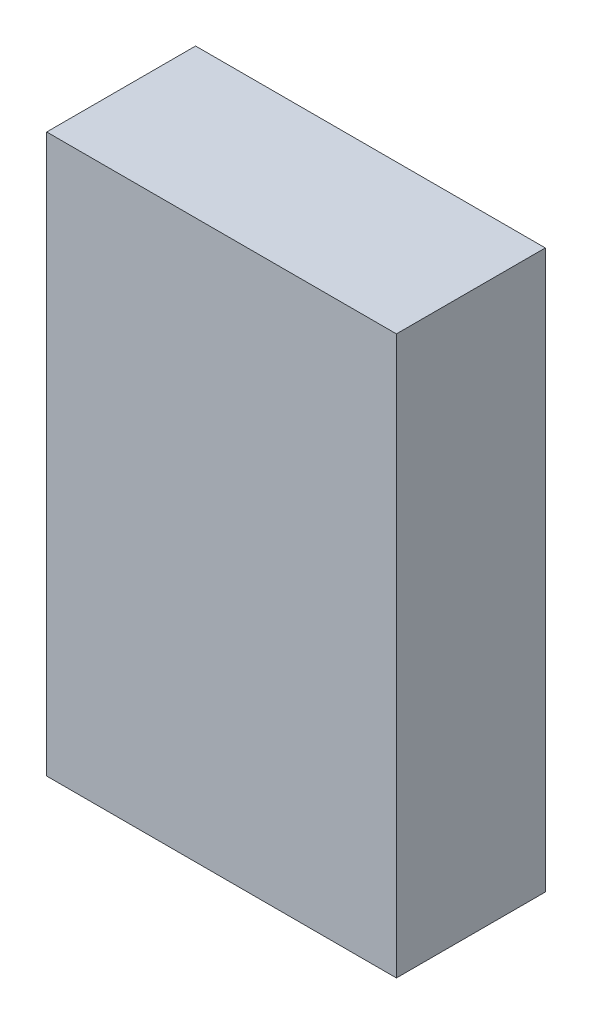
ISO-10303-21;
HEADER;
FILE_DESCRIPTION(('STEP AP214'),'2;1');
FILE_NAME('part.step','',(''),(''),'','','');
FILE_SCHEMA(('AUTOMOTIVE_DESIGN { 1 0 10303 214 1 1 1 1 }'));
ENDSEC;
DATA;
#1=APPLICATION_CONTEXT('core data for automotive mechanical design processes');
#2=APPLICATION_PROTOCOL_DEFINITION('international standard','automotive_design',2000,#1);
#3=PRODUCT_CONTEXT('',#1,'mechanical');
#4=PRODUCT('Part','Part','',(#3));
#5=PRODUCT_RELATED_PRODUCT_CATEGORY('part','',(#4));
#6=PRODUCT_DEFINITION_FORMATION('','',#4);
#7=PRODUCT_DEFINITION_CONTEXT('part definition',#1,'design');
#8=PRODUCT_DEFINITION('design','',#6,#7);
#9=PRODUCT_DEFINITION_SHAPE('','',#8);
#10=(LENGTH_UNIT() NAMED_UNIT(*) SI_UNIT(.MILLI.,.METRE.));
#11=(NAMED_UNIT(*) PLANE_ANGLE_UNIT() SI_UNIT($,.RADIAN.));
#12=(NAMED_UNIT(*) SI_UNIT($,.STERADIAN.) SOLID_ANGLE_UNIT());
#13=UNCERTAINTY_MEASURE_WITH_UNIT(LENGTH_MEASURE(1.E-05),#10,'distance_accuracy_value','');
#14=(GEOMETRIC_REPRESENTATION_CONTEXT(3) GLOBAL_UNCERTAINTY_ASSIGNED_CONTEXT((#13)) GLOBAL_UNIT_ASSIGNED_CONTEXT((#10,
#11,#12)) REPRESENTATION_CONTEXT('',''));
#15=CARTESIAN_POINT('',(0.,0.,0.));
#16=DIRECTION('',(0.,0.,1.));
#17=DIRECTION('',(1.,0.,0.));
#18=AXIS2_PLACEMENT_3D('',#15,#16,#17);
#19=CARTESIAN_POINT('',(10.1,-16.11,8.6));
#20=DIRECTION('',(-1.,0.,0.));
#21=DIRECTION('',(0.,0.,1.));
#22=AXIS2_PLACEMENT_3D('',#19,#20,#21);
#23=PLANE('',#22);
#24=DIRECTION('',(0.,1.,0.));
#25=VECTOR('',#24,1.);
#26=CARTESIAN_POINT('',(10.1,-16.11,0.));
#27=LINE('',#26,#25);
#28=CARTESIAN_POINT('',(10.1,-16.11,0.));
#29=VERTEX_POINT('',#28);
#30=CARTESIAN_POINT('',(10.1,16.11,0.));
#31=VERTEX_POINT('',#30);
#32=EDGE_CURVE('E102',#29,#31,#27,.T.);
#33=ORIENTED_EDGE('',*,*,#32,.T.);
#34=DIRECTION('',(0.,0.,-1.));
#35=VECTOR('',#34,1.);
#36=CARTESIAN_POINT('',(10.1,16.11,8.6));
#37=LINE('',#36,#35);
#38=CARTESIAN_POINT('',(10.1,16.11,8.6));
#39=VERTEX_POINT('',#38);
#40=EDGE_CURVE('E11',#39,#31,#37,.T.);
#41=ORIENTED_EDGE('',*,*,#40,.F.);
#42=DIRECTION('',(0.,1.,0.));
#43=VECTOR('',#42,1.);
#44=CARTESIAN_POINT('',(10.1,-16.11,8.6));
#45=LINE('',#44,#43);
#46=CARTESIAN_POINT('',(10.1,-16.11,8.6));
#47=VERTEX_POINT('',#46);
#48=EDGE_CURVE('E90',#47,#39,#45,.T.);
#49=ORIENTED_EDGE('',*,*,#48,.F.);
#50=DIRECTION('',(0.,0.,-1.));
#51=VECTOR('',#50,1.);
#52=CARTESIAN_POINT('',(10.1,-16.11,8.6));
#53=LINE('',#52,#51);
#54=EDGE_CURVE('E98',#47,#29,#53,.T.);
#55=ORIENTED_EDGE('',*,*,#54,.T.);
#56=EDGE_LOOP('',(#33,#41,#49,#55));
#57=FACE_BOUND('',#56,.T.);
#58=ADVANCED_FACE('F39',(#57),#23,.F.);
#59=CARTESIAN_POINT('',(-10.1,16.11,8.6));
#60=DIRECTION('',(0.,-1.,0.));
#61=DIRECTION('',(0.,0.,-1.));
#62=AXIS2_PLACEMENT_3D('',#59,#60,#61);
#63=PLANE('',#62);
#64=DIRECTION('',(-1.,0.,0.));
#65=VECTOR('',#64,1.);
#66=CARTESIAN_POINT('',(-10.1,16.11,0.));
#67=LINE('',#66,#65);
#68=CARTESIAN_POINT('',(-10.1,16.11,0.));
#69=VERTEX_POINT('',#68);
#70=EDGE_CURVE('E94',#31,#69,#67,.T.);
#71=ORIENTED_EDGE('',*,*,#70,.T.);
#72=DIRECTION('',(0.,0.,-1.));
#73=VECTOR('',#72,1.);
#74=CARTESIAN_POINT('',(-10.1,16.11,8.6));
#75=LINE('',#74,#73);
#76=CARTESIAN_POINT('',(-10.1,16.11,8.6));
#77=VERTEX_POINT('',#76);
#78=EDGE_CURVE('E47',#77,#69,#75,.T.);
#79=ORIENTED_EDGE('',*,*,#78,.F.);
#80=DIRECTION('',(-1.,0.,0.));
#81=VECTOR('',#80,1.);
#82=CARTESIAN_POINT('',(-10.1,16.11,8.6));
#83=LINE('',#82,#81);
#84=EDGE_CURVE('E85',#39,#77,#83,.T.);
#85=ORIENTED_EDGE('',*,*,#84,.F.);
#86=ORIENTED_EDGE('',*,*,#40,.T.);
#87=EDGE_LOOP('',(#71,#79,#85,#86));
#88=FACE_BOUND('',#87,.T.);
#89=ADVANCED_FACE('F93',(#88),#63,.F.);
#90=CARTESIAN_POINT('',(-10.1,-16.11,8.6));
#91=DIRECTION('',(1.,0.,0.));
#92=DIRECTION('',(0.,0.,-1.));
#93=AXIS2_PLACEMENT_3D('',#90,#91,#92);
#94=PLANE('',#93);
#95=DIRECTION('',(0.,-1.,0.));
#96=VECTOR('',#95,1.);
#97=CARTESIAN_POINT('',(-10.1,-16.11,0.));
#98=LINE('',#97,#96);
#99=CARTESIAN_POINT('',(-10.1,-16.11,0.));
#100=VERTEX_POINT('',#99);
#101=EDGE_CURVE('E72',#69,#100,#98,.T.);
#102=ORIENTED_EDGE('',*,*,#101,.T.);
#103=DIRECTION('',(0.,0.,-1.));
#104=VECTOR('',#103,1.);
#105=CARTESIAN_POINT('',(-10.1,-16.11,8.6));
#106=LINE('',#105,#104);
#107=CARTESIAN_POINT('',(-10.1,-16.11,8.6));
#108=VERTEX_POINT('',#107);
#109=EDGE_CURVE('E95',#108,#100,#106,.T.);
#110=ORIENTED_EDGE('',*,*,#109,.F.);
#111=DIRECTION('',(0.,-1.,0.));
#112=VECTOR('',#111,1.);
#113=CARTESIAN_POINT('',(-10.1,-16.11,8.6));
#114=LINE('',#113,#112);
#115=EDGE_CURVE('E88',#77,#108,#114,.T.);
#116=ORIENTED_EDGE('',*,*,#115,.F.);
#117=ORIENTED_EDGE('',*,*,#78,.T.);
#118=EDGE_LOOP('',(#102,#110,#116,#117));
#119=FACE_BOUND('',#118,.T.);
#120=ADVANCED_FACE('F96',(#119),#94,.F.);
#121=CARTESIAN_POINT('',(-10.1,-16.11,8.6));
#122=DIRECTION('',(0.,1.,0.));
#123=DIRECTION('',(0.,0.,1.));
#124=AXIS2_PLACEMENT_3D('',#121,#122,#123);
#125=PLANE('',#124);
#126=DIRECTION('',(1.,0.,0.));
#127=VECTOR('',#126,1.);
#128=CARTESIAN_POINT('',(-10.1,-16.11,0.));
#129=LINE('',#128,#127);
#130=EDGE_CURVE('E78',#100,#29,#129,.T.);
#131=ORIENTED_EDGE('',*,*,#130,.T.);
#132=ORIENTED_EDGE('',*,*,#54,.F.);
#133=DIRECTION('',(1.,0.,0.));
#134=VECTOR('',#133,1.);
#135=CARTESIAN_POINT('',(-10.1,-16.11,8.6));
#136=LINE('',#135,#134);
#137=EDGE_CURVE('E55',#108,#47,#136,.T.);
#138=ORIENTED_EDGE('',*,*,#137,.F.);
#139=ORIENTED_EDGE('',*,*,#109,.T.);
#140=EDGE_LOOP('',(#131,#132,#138,#139));
#141=FACE_BOUND('',#140,.T.);
#142=ADVANCED_FACE('F109',(#141),#125,.F.);
#143=CARTESIAN_POINT('',(0.,0.,8.6));
#144=DIRECTION('',(0.,0.,-1.));
#145=DIRECTION('',(-1.,0.,0.));
#146=AXIS2_PLACEMENT_3D('',#143,#144,#145);
#147=PLANE('',#146);
#148=ORIENTED_EDGE('',*,*,#48,.T.);
#149=ORIENTED_EDGE('',*,*,#84,.T.);
#150=ORIENTED_EDGE('',*,*,#115,.T.);
#151=ORIENTED_EDGE('',*,*,#137,.T.);
#152=EDGE_LOOP('',(#148,#149,#150,#151));
#153=FACE_BOUND('',#152,.T.);
#154=ADVANCED_FACE('F86',(#153),#147,.F.);
#155=CARTESIAN_POINT('',(0.,0.,0.));
#156=DIRECTION('',(0.,0.,-1.));
#157=DIRECTION('',(-1.,0.,0.));
#158=AXIS2_PLACEMENT_3D('',#155,#156,#157);
#159=PLANE('',#158);
#160=ORIENTED_EDGE('',*,*,#32,.F.);
#161=ORIENTED_EDGE('',*,*,#130,.F.);
#162=ORIENTED_EDGE('',*,*,#101,.F.);
#163=ORIENTED_EDGE('',*,*,#70,.F.);
#164=EDGE_LOOP('',(#160,#161,#162,#163));
#165=FACE_BOUND('',#164,.T.);
#166=ADVANCED_FACE('F112',(#165),#159,.T.);
#167=CLOSED_SHELL('',(#58,#89,#120,#142,#154,#166));
#168=MANIFOLD_SOLID_BREP('B2',#167);
#169=ADVANCED_BREP_SHAPE_REPRESENTATION('',(#18,#168),#14);
#170=SHAPE_DEFINITION_REPRESENTATION(#9,#169);
ENDSEC;
END-ISO-10303-21;
